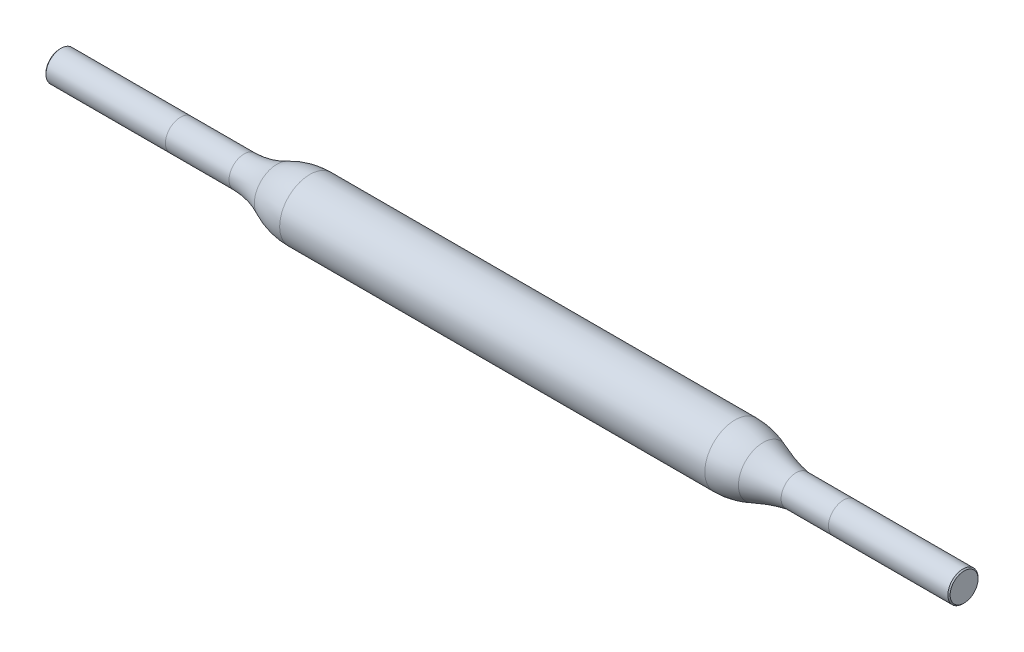
ISO-10303-21;
HEADER;
FILE_DESCRIPTION(('STEP AP214'),'2;1');
FILE_NAME('part.step','',(''),(''),'','','');
FILE_SCHEMA(('AUTOMOTIVE_DESIGN { 1 0 10303 214 1 1 1 1 }'));
ENDSEC;
DATA;
#1=APPLICATION_CONTEXT('core data for automotive mechanical design processes');
#2=APPLICATION_PROTOCOL_DEFINITION('international standard','automotive_design',2000,#1);
#3=PRODUCT_CONTEXT('',#1,'mechanical');
#4=PRODUCT('Part','Part','',(#3));
#5=PRODUCT_RELATED_PRODUCT_CATEGORY('part','',(#4));
#6=PRODUCT_DEFINITION_FORMATION('','',#4);
#7=PRODUCT_DEFINITION_CONTEXT('part definition',#1,'design');
#8=PRODUCT_DEFINITION('design','',#6,#7);
#9=PRODUCT_DEFINITION_SHAPE('','',#8);
#10=(LENGTH_UNIT() NAMED_UNIT(*) SI_UNIT(.MILLI.,.METRE.));
#11=(NAMED_UNIT(*) PLANE_ANGLE_UNIT() SI_UNIT($,.RADIAN.));
#12=(NAMED_UNIT(*) SI_UNIT($,.STERADIAN.) SOLID_ANGLE_UNIT());
#13=UNCERTAINTY_MEASURE_WITH_UNIT(LENGTH_MEASURE(1.E-05),#10,'distance_accuracy_value','');
#14=(GEOMETRIC_REPRESENTATION_CONTEXT(3) GLOBAL_UNCERTAINTY_ASSIGNED_CONTEXT((#13)) GLOBAL_UNIT_ASSIGNED_CONTEXT((#10,
#11,#12)) REPRESENTATION_CONTEXT('',''));
#15=CARTESIAN_POINT('',(0.,0.,0.));
#16=DIRECTION('',(0.,0.,1.));
#17=DIRECTION('',(1.,0.,0.));
#18=AXIS2_PLACEMENT_3D('',#15,#16,#17);
#19=CARTESIAN_POINT('',(-31.1298798798799,0.,0.));
#20=DIRECTION('',(-1.,0.,0.));
#21=DIRECTION('',(0.,0.,1.));
#22=AXIS2_PLACEMENT_3D('',#19,#20,#21);
#23=CYLINDRICAL_SURFACE('',#22,1.);
#24=CARTESIAN_POINT('',(17.7271196219921,0.,0.));
#25=DIRECTION('',(-1.,0.,0.));
#26=DIRECTION('',(0.,0.,1.));
#27=AXIS2_PLACEMENT_3D('',#24,#25,#26);
#28=CIRCLE('',#27,0.999999999999999);
#29=CARTESIAN_POINT('',(17.7271196219921,0.,0.999999999999999));
#30=VERTEX_POINT('',#29);
#31=EDGE_CURVE('E78',#30,#30,#28,.T.);
#32=ORIENTED_EDGE('',*,*,#31,.F.);
#33=EDGE_LOOP('',(#32));
#34=FACE_BOUND('',#33,.T.);
#35=CARTESIAN_POINT('',(20.8701201201201,0.,0.));
#36=DIRECTION('',(1.,0.,0.));
#37=DIRECTION('',(0.,0.,-1.));
#38=AXIS2_PLACEMENT_3D('',#35,#36,#37);
#39=CIRCLE('',#38,1.);
#40=CARTESIAN_POINT('',(20.8701201201201,0.,-1.));
#41=VERTEX_POINT('',#40);
#42=EDGE_CURVE('E70',#41,#41,#39,.T.);
#43=ORIENTED_EDGE('',*,*,#42,.F.);
#44=EDGE_LOOP('',(#43));
#45=FACE_BOUND('',#44,.T.);
#46=ADVANCED_FACE('F45',(#34,#45),#23,.T.);
#47=CARTESIAN_POINT('',(-31.1298798798799,0.,0.));
#48=DIRECTION('',(-1.,0.,0.));
#49=DIRECTION('',(0.,0.,1.));
#50=AXIS2_PLACEMENT_3D('',#47,#48,#49);
#51=CYLINDRICAL_SURFACE('',#50,1.);
#52=CARTESIAN_POINT('',(-31.0548798798799,0.,0.));
#53=DIRECTION('',(1.,0.,0.));
#54=DIRECTION('',(0.,0.,-1.));
#55=AXIS2_PLACEMENT_3D('',#52,#53,#54);
#56=CIRCLE('',#55,1.);
#57=CARTESIAN_POINT('',(-31.0548798798799,0.,-1.));
#58=VERTEX_POINT('',#57);
#59=EDGE_CURVE('E10',#58,#58,#56,.T.);
#60=ORIENTED_EDGE('',*,*,#59,.T.);
#61=EDGE_LOOP('',(#60));
#62=FACE_BOUND('',#61,.T.);
#63=CARTESIAN_POINT('',(-23.1298798798799,0.,0.));
#64=DIRECTION('',(1.,0.,0.));
#65=DIRECTION('',(0.,0.,-1.));
#66=AXIS2_PLACEMENT_3D('',#63,#64,#65);
#67=CIRCLE('',#66,1.);
#68=CARTESIAN_POINT('',(-23.1298798798799,0.,-1.));
#69=VERTEX_POINT('',#68);
#70=EDGE_CURVE('E74',#69,#69,#67,.T.);
#71=ORIENTED_EDGE('',*,*,#70,.F.);
#72=EDGE_LOOP('',(#71));
#73=FACE_BOUND('',#72,.T.);
#74=ADVANCED_FACE('F138',(#62,#73),#51,.T.);
#75=CARTESIAN_POINT('',(-31.1298798798799,0.,0.));
#76=DIRECTION('',(1.,0.,0.));
#77=DIRECTION('',(0.,0.,-1.));
#78=AXIS2_PLACEMENT_3D('',#75,#76,#77);
#79=PLANE('',#78);
#80=CARTESIAN_POINT('',(-31.1298798798799,0.,0.));
#81=DIRECTION('',(1.,0.,0.));
#82=DIRECTION('',(0.,0.,-1.));
#83=AXIS2_PLACEMENT_3D('',#80,#81,#82);
#84=CIRCLE('',#83,0.924999999999995);
#85=CARTESIAN_POINT('',(-31.1298798798799,0.,-0.924999999999995));
#86=VERTEX_POINT('',#85);
#87=EDGE_CURVE('E54',#86,#86,#84,.F.);
#88=ORIENTED_EDGE('',*,*,#87,.T.);
#89=EDGE_LOOP('',(#88));
#90=FACE_BOUND('',#89,.T.);
#91=ADVANCED_FACE('F148',(#90),#79,.F.);
#92=CARTESIAN_POINT('',(28.8701201201201,0.,0.));
#93=DIRECTION('',(-1.,0.,0.));
#94=DIRECTION('',(0.,0.,1.));
#95=AXIS2_PLACEMENT_3D('',#92,#93,#94);
#96=PLANE('',#95);
#97=CARTESIAN_POINT('',(28.8701201201201,0.,0.));
#98=DIRECTION('',(-1.,0.,0.));
#99=DIRECTION('',(0.,0.,1.));
#100=AXIS2_PLACEMENT_3D('',#97,#98,#99);
#101=CIRCLE('',#100,0.924999999999985);
#102=CARTESIAN_POINT('',(28.8701201201201,0.,0.924999999999985));
#103=VERTEX_POINT('',#102);
#104=EDGE_CURVE('E59',#103,#103,#101,.F.);
#105=ORIENTED_EDGE('',*,*,#104,.T.);
#106=EDGE_LOOP('',(#105));
#107=FACE_BOUND('',#106,.T.);
#108=ADVANCED_FACE('F143',(#107),#96,.F.);
#109=CARTESIAN_POINT('',(28.7951201201201,0.,0.));
#110=DIRECTION('',(-1.,0.,0.));
#111=DIRECTION('',(0.,0.,1.));
#112=AXIS2_PLACEMENT_3D('',#109,#110,#111);
#113=CIRCLE('',#112,1.);
#114=CARTESIAN_POINT('',(28.7951201201201,0.,1.));
#115=VERTEX_POINT('',#114);
#116=EDGE_CURVE('E64',#115,#115,#113,.T.);
#117=ORIENTED_EDGE('',*,*,#116,.T.);
#118=EDGE_LOOP('',(#117));
#119=FACE_BOUND('',#118,.T.);
#120=ORIENTED_EDGE('',*,*,#42,.T.);
#121=EDGE_LOOP('',(#120));
#122=FACE_BOUND('',#121,.T.);
#123=ADVANCED_FACE('F132',(#119,#122),#23,.T.);
#124=CARTESIAN_POINT('',(19.8075598675103,0.,0.));
#125=DIRECTION('',(-1.,0.,0.));
#126=DIRECTION('',(0.,0.,1.));
#127=AXIS2_PLACEMENT_3D('',#124,#125,#126);
#128=TOROIDAL_SURFACE('',#127,12.2413207365547,11.4322142875852);
#129=CARTESIAN_POINT('',(15.5346964897989,0.,0.));
#130=DIRECTION('',(-1.,0.,0.));
#131=DIRECTION('',(0.,0.,1.));
#132=AXIS2_PLACEMENT_3D('',#129,#130,#131);
#133=CIRCLE('',#132,1.63763448729785);
#134=CARTESIAN_POINT('',(15.5346964897989,0.,1.63763448729785));
#135=VERTEX_POINT('',#134);
#136=EDGE_CURVE('E82',#135,#135,#133,.T.);
#137=ORIENTED_EDGE('',*,*,#136,.F.);
#138=EDGE_LOOP('',(#137));
#139=FACE_BOUND('',#138,.T.);
#140=ORIENTED_EDGE('',*,*,#31,.T.);
#141=EDGE_LOOP('',(#140));
#142=FACE_BOUND('',#141,.T.);
#143=ADVANCED_FACE('F126',(#139,#142),#128,.F.);
#144=CARTESIAN_POINT('',(13.6659144366355,0.,0.));
#145=DIRECTION('',(-1.,0.,0.));
#146=DIRECTION('',(0.,0.,1.));
#147=AXIS2_PLACEMENT_3D('',#144,#145,#146);
#148=DEGENERATE_TOROIDAL_SURFACE('',#147,3.,5.,.F.);
#149=CARTESIAN_POINT('',(13.6659144366355,0.,0.));
#150=DIRECTION('',(-1.,0.,0.));
#151=DIRECTION('',(0.,0.,1.));
#152=AXIS2_PLACEMENT_3D('',#149,#150,#151);
#153=CIRCLE('',#152,2.);
#154=CARTESIAN_POINT('',(13.6659144366355,0.,2.));
#155=VERTEX_POINT('',#154);
#156=EDGE_CURVE('E86',#155,#155,#153,.T.);
#157=ORIENTED_EDGE('',*,*,#156,.F.);
#158=EDGE_LOOP('',(#157));
#159=FACE_BOUND('',#158,.T.);
#160=ORIENTED_EDGE('',*,*,#136,.T.);
#161=EDGE_LOOP('',(#160));
#162=FACE_BOUND('',#161,.T.);
#163=ADVANCED_FACE('F120',(#159,#162),#148,.F.);
#164=CARTESIAN_POINT('',(-31.1298798798799,0.,0.));
#165=DIRECTION('',(-1.,0.,0.));
#166=DIRECTION('',(0.,0.,1.));
#167=AXIS2_PLACEMENT_3D('',#164,#165,#166);
#168=CYLINDRICAL_SURFACE('',#167,2.);
#169=CARTESIAN_POINT('',(-14.5481048501098,0.,0.));
#170=DIRECTION('',(-1.,0.,0.));
#171=DIRECTION('',(0.,0.,1.));
#172=AXIS2_PLACEMENT_3D('',#169,#170,#171);
#173=CIRCLE('',#172,2.);
#174=CARTESIAN_POINT('',(-14.5481048501098,0.,2.));
#175=VERTEX_POINT('',#174);
#176=EDGE_CURVE('E90',#175,#175,#173,.T.);
#177=ORIENTED_EDGE('',*,*,#176,.F.);
#178=EDGE_LOOP('',(#177));
#179=FACE_BOUND('',#178,.T.);
#180=ORIENTED_EDGE('',*,*,#156,.T.);
#181=EDGE_LOOP('',(#180));
#182=FACE_BOUND('',#181,.T.);
#183=ADVANCED_FACE('F114',(#179,#182),#168,.T.);
#184=CARTESIAN_POINT('',(-14.5481048501098,0.,0.));
#185=DIRECTION('',(-1.,0.,0.));
#186=DIRECTION('',(0.,0.,1.));
#187=AXIS2_PLACEMENT_3D('',#184,#185,#186);
#188=DEGENERATE_TOROIDAL_SURFACE('',#187,3.,5.,.F.);
#189=CARTESIAN_POINT('',(-16.7275543218802,0.,0.));
#190=DIRECTION('',(-1.,0.,0.));
#191=DIRECTION('',(0.,0.,1.));
#192=AXIS2_PLACEMENT_3D('',#189,#190,#191);
#193=CIRCLE('',#192,1.5);
#194=CARTESIAN_POINT('',(-16.7275543218802,0.,1.5));
#195=VERTEX_POINT('',#194);
#196=EDGE_CURVE('E94',#195,#195,#193,.T.);
#197=ORIENTED_EDGE('',*,*,#196,.F.);
#198=EDGE_LOOP('',(#197));
#199=FACE_BOUND('',#198,.T.);
#200=ORIENTED_EDGE('',*,*,#176,.T.);
#201=EDGE_LOOP('',(#200));
#202=FACE_BOUND('',#201,.T.);
#203=ADVANCED_FACE('F108',(#199,#202),#188,.F.);
#204=CARTESIAN_POINT('',(-18.9070037936505,0.,0.));
#205=DIRECTION('',(-1.,0.,0.));
#206=DIRECTION('',(0.,0.,1.));
#207=AXIS2_PLACEMENT_3D('',#204,#205,#206);
#208=TOROIDAL_SURFACE('',#207,6.,5.);
#209=CARTESIAN_POINT('',(-18.9070037936505,0.,0.));
#210=DIRECTION('',(-1.,0.,0.));
#211=DIRECTION('',(0.,0.,1.));
#212=AXIS2_PLACEMENT_3D('',#209,#210,#211);
#213=CIRCLE('',#212,0.999999999999999);
#214=CARTESIAN_POINT('',(-18.9070037936505,0.,0.999999999999999));
#215=VERTEX_POINT('',#214);
#216=EDGE_CURVE('E98',#215,#215,#213,.T.);
#217=ORIENTED_EDGE('',*,*,#216,.F.);
#218=EDGE_LOOP('',(#217));
#219=FACE_BOUND('',#218,.T.);
#220=ORIENTED_EDGE('',*,*,#196,.T.);
#221=EDGE_LOOP('',(#220));
#222=FACE_BOUND('',#221,.T.);
#223=ADVANCED_FACE('F105',(#219,#222),#208,.F.);
#224=ORIENTED_EDGE('',*,*,#70,.T.);
#225=EDGE_LOOP('',(#224));
#226=FACE_BOUND('',#225,.T.);
#227=ORIENTED_EDGE('',*,*,#216,.T.);
#228=EDGE_LOOP('',(#227));
#229=FACE_BOUND('',#228,.T.);
#230=ADVANCED_FACE('F103',(#226,#229),#51,.T.);
#231=CARTESIAN_POINT('',(28.7951201201201,0.,0.));
#232=DIRECTION('',(-1.,0.,0.));
#233=DIRECTION('',(0.,0.,1.));
#234=AXIS2_PLACEMENT_3D('',#231,#232,#233);
#235=CONICAL_SURFACE('',#234,1.,0.785398163397487);
#236=ORIENTED_EDGE('',*,*,#104,.F.);
#237=EDGE_LOOP('',(#236));
#238=FACE_BOUND('',#237,.T.);
#239=ORIENTED_EDGE('',*,*,#116,.F.);
#240=EDGE_LOOP('',(#239));
#241=FACE_BOUND('',#240,.T.);
#242=ADVANCED_FACE('F154',(#238,#241),#235,.T.);
#243=CARTESIAN_POINT('',(-31.1298798798799,0.,0.));
#244=DIRECTION('',(1.,0.,0.));
#245=DIRECTION('',(0.,0.,-1.));
#246=AXIS2_PLACEMENT_3D('',#243,#244,#245);
#247=CONICAL_SURFACE('',#246,0.924999999999995,0.785398163397512);
#248=ORIENTED_EDGE('',*,*,#59,.F.);
#249=EDGE_LOOP('',(#248));
#250=FACE_BOUND('',#249,.T.);
#251=ORIENTED_EDGE('',*,*,#87,.F.);
#252=EDGE_LOOP('',(#251));
#253=FACE_BOUND('',#252,.T.);
#254=ADVANCED_FACE('F48',(#250,#253),#247,.T.);
#255=CLOSED_SHELL('',(#46,#74,#91,#108,#123,#143,#163,#183,#203,#223,#230,#242,#254));
#256=MANIFOLD_SOLID_BREP('B2',#255);
#257=ADVANCED_BREP_SHAPE_REPRESENTATION('',(#18,#256),#14);
#258=SHAPE_DEFINITION_REPRESENTATION(#9,#257);
ENDSEC;
END-ISO-10303-21;
